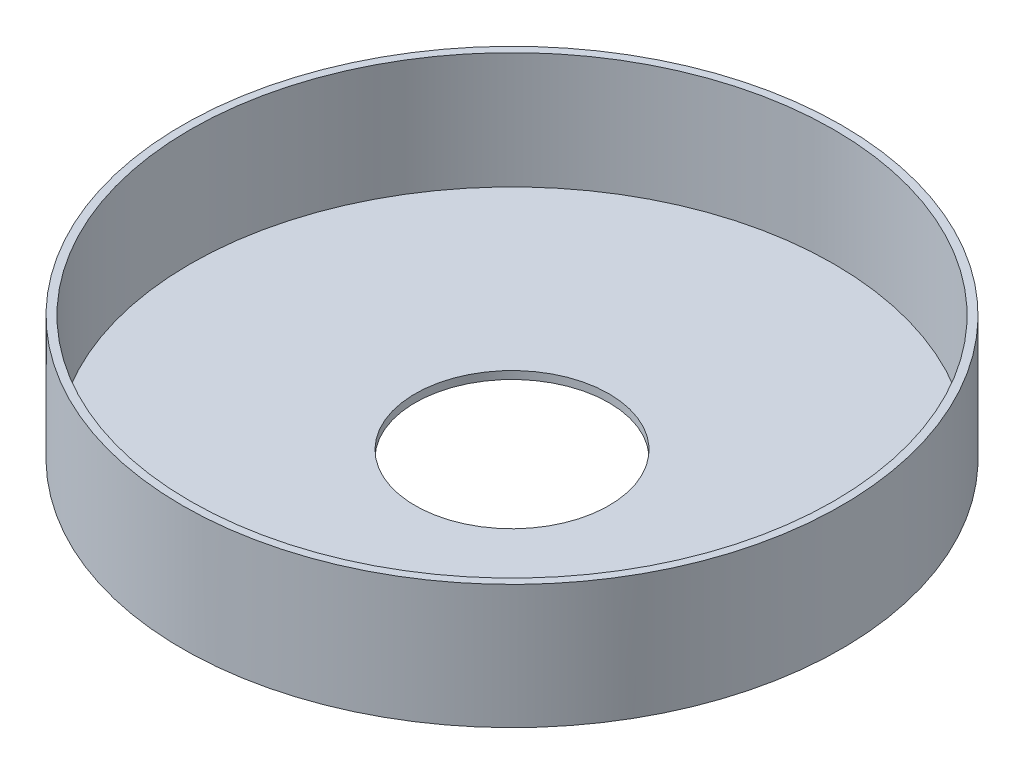
ISO-10303-21;
HEADER;
FILE_DESCRIPTION(('STEP AP214'),'2;1');
FILE_NAME('part.step','',(''),(''),'','','');
FILE_SCHEMA(('AUTOMOTIVE_DESIGN { 1 0 10303 214 1 1 1 1 }'));
ENDSEC;
DATA;
#1=APPLICATION_CONTEXT('core data for automotive mechanical design processes');
#2=APPLICATION_PROTOCOL_DEFINITION('international standard','automotive_design',2000,#1);
#3=PRODUCT_CONTEXT('',#1,'mechanical');
#4=PRODUCT('Part','Part','',(#3));
#5=PRODUCT_RELATED_PRODUCT_CATEGORY('part','',(#4));
#6=PRODUCT_DEFINITION_FORMATION('','',#4);
#7=PRODUCT_DEFINITION_CONTEXT('part definition',#1,'design');
#8=PRODUCT_DEFINITION('design','',#6,#7);
#9=PRODUCT_DEFINITION_SHAPE('','',#8);
#10=(LENGTH_UNIT() NAMED_UNIT(*) SI_UNIT(.MILLI.,.METRE.));
#11=(NAMED_UNIT(*) PLANE_ANGLE_UNIT() SI_UNIT($,.RADIAN.));
#12=(NAMED_UNIT(*) SI_UNIT($,.STERADIAN.) SOLID_ANGLE_UNIT());
#13=UNCERTAINTY_MEASURE_WITH_UNIT(LENGTH_MEASURE(1.E-05),#10,'distance_accuracy_value','');
#14=(GEOMETRIC_REPRESENTATION_CONTEXT(3) GLOBAL_UNCERTAINTY_ASSIGNED_CONTEXT((#13)) GLOBAL_UNIT_ASSIGNED_CONTEXT((#10,
#11,#12)) REPRESENTATION_CONTEXT('',''));
#15=CARTESIAN_POINT('',(0.,0.,0.));
#16=DIRECTION('',(0.,0.,1.));
#17=DIRECTION('',(1.,0.,0.));
#18=AXIS2_PLACEMENT_3D('',#15,#16,#17);
#19=CARTESIAN_POINT('',(0.,15.,0.));
#20=DIRECTION('',(0.,1.,0.));
#21=DIRECTION('',(0.,0.,1.));
#22=AXIS2_PLACEMENT_3D('',#19,#20,#21);
#23=PLANE('',#22);
#24=CARTESIAN_POINT('',(0.,15.,0.));
#25=DIRECTION('',(0.,1.,0.));
#26=DIRECTION('',(0.,0.,1.));
#27=AXIS2_PLACEMENT_3D('',#24,#25,#26);
#28=CIRCLE('',#27,42.5);
#29=CARTESIAN_POINT('',(0.,15.,42.5));
#30=VERTEX_POINT('',#29);
#31=EDGE_CURVE('E10',#30,#30,#28,.T.);
#32=ORIENTED_EDGE('',*,*,#31,.T.);
#33=EDGE_LOOP('',(#32));
#34=FACE_BOUND('',#33,.T.);
#35=CARTESIAN_POINT('',(0.,15.,0.));
#36=DIRECTION('',(0.,1.,0.));
#37=DIRECTION('',(0.,0.,1.));
#38=AXIS2_PLACEMENT_3D('',#35,#36,#37);
#39=CIRCLE('',#38,41.5);
#40=CARTESIAN_POINT('',(0.,15.,41.5));
#41=VERTEX_POINT('',#40);
#42=EDGE_CURVE('E45',#41,#41,#39,.T.);
#43=ORIENTED_EDGE('',*,*,#42,.F.);
#44=EDGE_LOOP('',(#43));
#45=FACE_BOUND('',#44,.T.);
#46=ADVANCED_FACE('F37',(#34,#45),#23,.T.);
#47=CARTESIAN_POINT('',(0.,15.,0.));
#48=DIRECTION('',(0.,-1.,0.));
#49=DIRECTION('',(0.,0.,-1.));
#50=AXIS2_PLACEMENT_3D('',#47,#48,#49);
#51=CYLINDRICAL_SURFACE('',#50,42.5);
#52=ORIENTED_EDGE('',*,*,#31,.F.);
#53=EDGE_LOOP('',(#52));
#54=FACE_BOUND('',#53,.T.);
#55=CARTESIAN_POINT('',(0.,-1.,0.));
#56=DIRECTION('',(0.,-1.,0.));
#57=DIRECTION('',(0.,0.,-1.));
#58=AXIS2_PLACEMENT_3D('',#55,#56,#57);
#59=CIRCLE('',#58,42.5);
#60=CARTESIAN_POINT('',(0.,-1.,-42.5));
#61=VERTEX_POINT('',#60);
#62=EDGE_CURVE('E56',#61,#61,#59,.T.);
#63=ORIENTED_EDGE('',*,*,#62,.F.);
#64=EDGE_LOOP('',(#63));
#65=FACE_BOUND('',#64,.T.);
#66=ADVANCED_FACE('F39',(#54,#65),#51,.T.);
#67=CARTESIAN_POINT('',(0.,15.,0.));
#68=DIRECTION('',(0.,-1.,0.));
#69=DIRECTION('',(0.,0.,-1.));
#70=AXIS2_PLACEMENT_3D('',#67,#68,#69);
#71=CYLINDRICAL_SURFACE('',#70,41.5);
#72=ORIENTED_EDGE('',*,*,#42,.T.);
#73=EDGE_LOOP('',(#72));
#74=FACE_BOUND('',#73,.T.);
#75=CARTESIAN_POINT('',(0.,0.,0.));
#76=DIRECTION('',(0.,1.,0.));
#77=DIRECTION('',(0.,0.,1.));
#78=AXIS2_PLACEMENT_3D('',#75,#76,#77);
#79=CIRCLE('',#78,41.5);
#80=CARTESIAN_POINT('',(0.,0.,41.5));
#81=VERTEX_POINT('',#80);
#82=EDGE_CURVE('E50',#81,#81,#79,.T.);
#83=ORIENTED_EDGE('',*,*,#82,.F.);
#84=EDGE_LOOP('',(#83));
#85=FACE_BOUND('',#84,.T.);
#86=ADVANCED_FACE('F83',(#74,#85),#71,.F.);
#87=CARTESIAN_POINT('',(0.,0.,0.));
#88=DIRECTION('',(0.,-1.,0.));
#89=DIRECTION('',(0.,0.,-1.));
#90=AXIS2_PLACEMENT_3D('',#87,#88,#89);
#91=PLANE('',#90);
#92=CARTESIAN_POINT('',(0.,0.,0.));
#93=DIRECTION('',(0.,-1.,0.));
#94=DIRECTION('',(0.,0.,-1.));
#95=AXIS2_PLACEMENT_3D('',#92,#93,#94);
#96=CIRCLE('',#95,12.5);
#97=CARTESIAN_POINT('',(0.,0.,-12.5));
#98=VERTEX_POINT('',#97);
#99=EDGE_CURVE('E62',#98,#98,#96,.T.);
#100=ORIENTED_EDGE('',*,*,#99,.T.);
#101=EDGE_LOOP('',(#100));
#102=FACE_BOUND('',#101,.T.);
#103=ORIENTED_EDGE('',*,*,#82,.T.);
#104=EDGE_LOOP('',(#103));
#105=FACE_BOUND('',#104,.T.);
#106=ADVANCED_FACE('F75',(#102,#105),#91,.F.);
#107=CARTESIAN_POINT('',(0.,-1.,0.));
#108=DIRECTION('',(0.,-1.,0.));
#109=DIRECTION('',(0.,0.,-1.));
#110=AXIS2_PLACEMENT_3D('',#107,#108,#109);
#111=PLANE('',#110);
#112=ORIENTED_EDGE('',*,*,#62,.T.);
#113=EDGE_LOOP('',(#112));
#114=FACE_BOUND('',#113,.T.);
#115=CARTESIAN_POINT('',(0.,-1.,0.));
#116=DIRECTION('',(0.,-1.,0.));
#117=DIRECTION('',(0.,0.,-1.));
#118=AXIS2_PLACEMENT_3D('',#115,#116,#117);
#119=CIRCLE('',#118,12.5);
#120=CARTESIAN_POINT('',(0.,-1.,-12.5));
#121=VERTEX_POINT('',#120);
#122=EDGE_CURVE('E61',#121,#121,#119,.T.);
#123=ORIENTED_EDGE('',*,*,#122,.F.);
#124=EDGE_LOOP('',(#123));
#125=FACE_BOUND('',#124,.T.);
#126=ADVANCED_FACE('F73',(#114,#125),#111,.T.);
#127=CARTESIAN_POINT('',(0.,-1.,0.));
#128=DIRECTION('',(0.,1.,0.));
#129=DIRECTION('',(0.,0.,1.));
#130=AXIS2_PLACEMENT_3D('',#127,#128,#129);
#131=CYLINDRICAL_SURFACE('',#130,12.5);
#132=ORIENTED_EDGE('',*,*,#122,.T.);
#133=EDGE_LOOP('',(#132));
#134=FACE_BOUND('',#133,.T.);
#135=ORIENTED_EDGE('',*,*,#99,.F.);
#136=EDGE_LOOP('',(#135));
#137=FACE_BOUND('',#136,.T.);
#138=ADVANCED_FACE('F70',(#134,#137),#131,.F.);
#139=CLOSED_SHELL('',(#46,#66,#86,#106,#126,#138));
#140=MANIFOLD_SOLID_BREP('B2',#139);
#141=ADVANCED_BREP_SHAPE_REPRESENTATION('',(#18,#140),#14);
#142=SHAPE_DEFINITION_REPRESENTATION(#9,#141);
ENDSEC;
END-ISO-10303-21;
